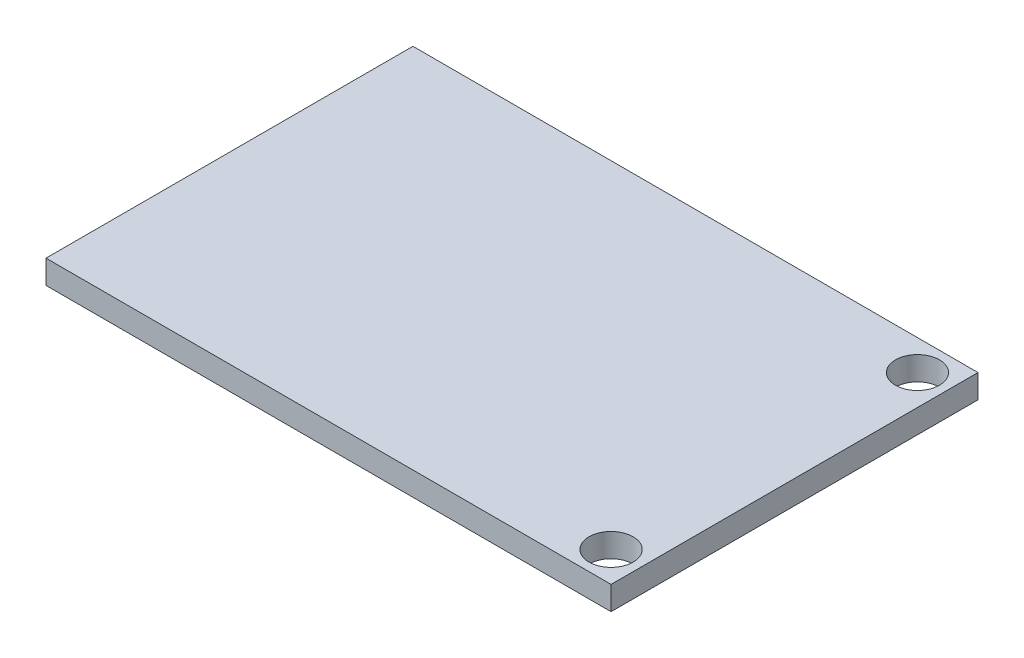
ISO-10303-21;
HEADER;
FILE_DESCRIPTION(('STEP AP214'),'2;1');
FILE_NAME('part.step','',(''),(''),'','','');
FILE_SCHEMA(('AUTOMOTIVE_DESIGN { 1 0 10303 214 1 1 1 1 }'));
ENDSEC;
DATA;
#1=APPLICATION_CONTEXT('core data for automotive mechanical design processes');
#2=APPLICATION_PROTOCOL_DEFINITION('international standard','automotive_design',2000,#1);
#3=PRODUCT_CONTEXT('',#1,'mechanical');
#4=PRODUCT('Part','Part','',(#3));
#5=PRODUCT_RELATED_PRODUCT_CATEGORY('part','',(#4));
#6=PRODUCT_DEFINITION_FORMATION('','',#4);
#7=PRODUCT_DEFINITION_CONTEXT('part definition',#1,'design');
#8=PRODUCT_DEFINITION('design','',#6,#7);
#9=PRODUCT_DEFINITION_SHAPE('','',#8);
#10=(LENGTH_UNIT() NAMED_UNIT(*) SI_UNIT(.MILLI.,.METRE.));
#11=(NAMED_UNIT(*) PLANE_ANGLE_UNIT() SI_UNIT($,.RADIAN.));
#12=(NAMED_UNIT(*) SI_UNIT($,.STERADIAN.) SOLID_ANGLE_UNIT());
#13=UNCERTAINTY_MEASURE_WITH_UNIT(LENGTH_MEASURE(1.E-05),#10,'distance_accuracy_value','');
#14=(GEOMETRIC_REPRESENTATION_CONTEXT(3) GLOBAL_UNCERTAINTY_ASSIGNED_CONTEXT((#13)) GLOBAL_UNIT_ASSIGNED_CONTEXT((#10,
#11,#12)) REPRESENTATION_CONTEXT('',''));
#15=CARTESIAN_POINT('',(0.,0.,0.));
#16=DIRECTION('',(0.,0.,1.));
#17=DIRECTION('',(1.,0.,0.));
#18=AXIS2_PLACEMENT_3D('',#15,#16,#17);
#19=CARTESIAN_POINT('',(19.558,1.6383,12.7));
#20=DIRECTION('',(-1.,0.,0.));
#21=DIRECTION('',(0.,0.,1.));
#22=AXIS2_PLACEMENT_3D('',#19,#20,#21);
#23=PLANE('',#22);
#24=DIRECTION('',(0.,0.,-1.));
#25=VECTOR('',#24,1.);
#26=CARTESIAN_POINT('',(19.558,0.,12.7));
#27=LINE('',#26,#25);
#28=CARTESIAN_POINT('',(19.558,0.,12.7));
#29=VERTEX_POINT('',#28);
#30=CARTESIAN_POINT('',(19.558,0.,-12.7));
#31=VERTEX_POINT('',#30);
#32=EDGE_CURVE('E109',#29,#31,#27,.T.);
#33=ORIENTED_EDGE('',*,*,#32,.T.);
#34=DIRECTION('',(0.,-1.,0.));
#35=VECTOR('',#34,1.);
#36=CARTESIAN_POINT('',(19.558,1.6383,-12.7));
#37=LINE('',#36,#35);
#38=CARTESIAN_POINT('',(19.558,1.6383,-12.7));
#39=VERTEX_POINT('',#38);
#40=EDGE_CURVE('E13',#39,#31,#37,.T.);
#41=ORIENTED_EDGE('',*,*,#40,.F.);
#42=DIRECTION('',(0.,0.,-1.));
#43=VECTOR('',#42,1.);
#44=CARTESIAN_POINT('',(19.558,1.6383,12.7));
#45=LINE('',#44,#43);
#46=CARTESIAN_POINT('',(19.558,1.6383,12.7));
#47=VERTEX_POINT('',#46);
#48=EDGE_CURVE('E97',#47,#39,#45,.T.);
#49=ORIENTED_EDGE('',*,*,#48,.F.);
#50=DIRECTION('',(0.,-1.,0.));
#51=VECTOR('',#50,1.);
#52=CARTESIAN_POINT('',(19.558,1.6383,12.7));
#53=LINE('',#52,#51);
#54=EDGE_CURVE('E105',#47,#29,#53,.T.);
#55=ORIENTED_EDGE('',*,*,#54,.T.);
#56=EDGE_LOOP('',(#33,#41,#49,#55));
#57=FACE_BOUND('',#56,.T.);
#58=ADVANCED_FACE('F46',(#57),#23,.F.);
#59=CARTESIAN_POINT('',(-19.558,1.6383,-12.7));
#60=DIRECTION('',(0.,0.,1.));
#61=DIRECTION('',(1.,0.,0.));
#62=AXIS2_PLACEMENT_3D('',#59,#60,#61);
#63=PLANE('',#62);
#64=DIRECTION('',(-1.,0.,0.));
#65=VECTOR('',#64,1.);
#66=CARTESIAN_POINT('',(-19.558,0.,-12.7));
#67=LINE('',#66,#65);
#68=CARTESIAN_POINT('',(-19.558,0.,-12.7));
#69=VERTEX_POINT('',#68);
#70=EDGE_CURVE('E101',#31,#69,#67,.T.);
#71=ORIENTED_EDGE('',*,*,#70,.T.);
#72=DIRECTION('',(0.,-1.,0.));
#73=VECTOR('',#72,1.);
#74=CARTESIAN_POINT('',(-19.558,1.6383,-12.7));
#75=LINE('',#74,#73);
#76=CARTESIAN_POINT('',(-19.558,1.6383,-12.7));
#77=VERTEX_POINT('',#76);
#78=EDGE_CURVE('E54',#77,#69,#75,.T.);
#79=ORIENTED_EDGE('',*,*,#78,.F.);
#80=DIRECTION('',(-1.,0.,0.));
#81=VECTOR('',#80,1.);
#82=CARTESIAN_POINT('',(-19.558,1.6383,-12.7));
#83=LINE('',#82,#81);
#84=EDGE_CURVE('E92',#39,#77,#83,.T.);
#85=ORIENTED_EDGE('',*,*,#84,.F.);
#86=ORIENTED_EDGE('',*,*,#40,.T.);
#87=EDGE_LOOP('',(#71,#79,#85,#86));
#88=FACE_BOUND('',#87,.T.);
#89=ADVANCED_FACE('F100',(#88),#63,.F.);
#90=CARTESIAN_POINT('',(-19.558,1.6383,12.7));
#91=DIRECTION('',(1.,0.,0.));
#92=DIRECTION('',(0.,0.,-1.));
#93=AXIS2_PLACEMENT_3D('',#90,#91,#92);
#94=PLANE('',#93);
#95=DIRECTION('',(0.,0.,1.));
#96=VECTOR('',#95,1.);
#97=CARTESIAN_POINT('',(-19.558,0.,12.7));
#98=LINE('',#97,#96);
#99=CARTESIAN_POINT('',(-19.558,0.,12.7));
#100=VERTEX_POINT('',#99);
#101=EDGE_CURVE('E79',#69,#100,#98,.T.);
#102=ORIENTED_EDGE('',*,*,#101,.T.);
#103=DIRECTION('',(0.,-1.,0.));
#104=VECTOR('',#103,1.);
#105=CARTESIAN_POINT('',(-19.558,1.6383,12.7));
#106=LINE('',#105,#104);
#107=CARTESIAN_POINT('',(-19.558,1.6383,12.7));
#108=VERTEX_POINT('',#107);
#109=EDGE_CURVE('E102',#108,#100,#106,.T.);
#110=ORIENTED_EDGE('',*,*,#109,.F.);
#111=DIRECTION('',(0.,0.,1.));
#112=VECTOR('',#111,1.);
#113=CARTESIAN_POINT('',(-19.558,1.6383,12.7));
#114=LINE('',#113,#112);
#115=EDGE_CURVE('E95',#77,#108,#114,.T.);
#116=ORIENTED_EDGE('',*,*,#115,.F.);
#117=ORIENTED_EDGE('',*,*,#78,.T.);
#118=EDGE_LOOP('',(#102,#110,#116,#117));
#119=FACE_BOUND('',#118,.T.);
#120=ADVANCED_FACE('F103',(#119),#94,.F.);
#121=CARTESIAN_POINT('',(-19.558,1.6383,12.7));
#122=DIRECTION('',(0.,0.,-1.));
#123=DIRECTION('',(-1.,0.,0.));
#124=AXIS2_PLACEMENT_3D('',#121,#122,#123);
#125=PLANE('',#124);
#126=DIRECTION('',(1.,0.,0.));
#127=VECTOR('',#126,1.);
#128=CARTESIAN_POINT('',(-19.558,0.,12.7));
#129=LINE('',#128,#127);
#130=EDGE_CURVE('E85',#100,#29,#129,.T.);
#131=ORIENTED_EDGE('',*,*,#130,.T.);
#132=ORIENTED_EDGE('',*,*,#54,.F.);
#133=DIRECTION('',(1.,0.,0.));
#134=VECTOR('',#133,1.);
#135=CARTESIAN_POINT('',(-19.558,1.6383,12.7));
#136=LINE('',#135,#134);
#137=EDGE_CURVE('E62',#108,#47,#136,.T.);
#138=ORIENTED_EDGE('',*,*,#137,.F.);
#139=ORIENTED_EDGE('',*,*,#109,.T.);
#140=EDGE_LOOP('',(#131,#132,#138,#139));
#141=FACE_BOUND('',#140,.T.);
#142=ADVANCED_FACE('F117',(#141),#125,.F.);
#143=CARTESIAN_POINT('',(0.,1.6383,0.));
#144=DIRECTION('',(0.,-1.,0.));
#145=DIRECTION('',(0.,0.,-1.));
#146=AXIS2_PLACEMENT_3D('',#143,#144,#145);
#147=PLANE('',#146);
#148=CARTESIAN_POINT('',(17.4625,1.6383,10.6045));
#149=DIRECTION('',(0.,1.,0.));
#150=DIRECTION('',(0.,0.,1.));
#151=AXIS2_PLACEMENT_3D('',#148,#149,#150);
#152=CIRCLE('',#151,1.524);
#153=CARTESIAN_POINT('',(17.4625,1.6383,12.1285));
#154=VERTEX_POINT('',#153);
#155=EDGE_CURVE('E129',#154,#154,#152,.T.);
#156=ORIENTED_EDGE('',*,*,#155,.F.);
#157=EDGE_LOOP('',(#156));
#158=FACE_BOUND('',#157,.T.);
#159=CARTESIAN_POINT('',(17.4625,1.6383,-10.6045));
#160=DIRECTION('',(0.,1.,0.));
#161=DIRECTION('',(0.,0.,-1.));
#162=AXIS2_PLACEMENT_3D('',#159,#160,#161);
#163=CIRCLE('',#162,1.524);
#164=CARTESIAN_POINT('',(17.4625,1.6383,-9.0805));
#165=VERTEX_POINT('',#164);
#166=EDGE_CURVE('E123',#165,#165,#163,.T.);
#167=ORIENTED_EDGE('',*,*,#166,.F.);
#168=EDGE_LOOP('',(#167));
#169=FACE_BOUND('',#168,.T.);
#170=ORIENTED_EDGE('',*,*,#48,.T.);
#171=ORIENTED_EDGE('',*,*,#84,.T.);
#172=ORIENTED_EDGE('',*,*,#115,.T.);
#173=ORIENTED_EDGE('',*,*,#137,.T.);
#174=EDGE_LOOP('',(#170,#171,#172,#173));
#175=FACE_BOUND('',#174,.T.);
#176=ADVANCED_FACE('F93',(#158,#169,#175),#147,.F.);
#177=CARTESIAN_POINT('',(0.,0.,0.));
#178=DIRECTION('',(0.,-1.,0.));
#179=DIRECTION('',(0.,0.,-1.));
#180=AXIS2_PLACEMENT_3D('',#177,#178,#179);
#181=PLANE('',#180);
#182=CARTESIAN_POINT('',(17.4625,0.,10.6045));
#183=DIRECTION('',(0.,1.,0.));
#184=DIRECTION('',(0.,0.,1.));
#185=AXIS2_PLACEMENT_3D('',#182,#183,#184);
#186=CIRCLE('',#185,1.524);
#187=CARTESIAN_POINT('',(17.4625,0.,12.1285));
#188=VERTEX_POINT('',#187);
#189=EDGE_CURVE('E112',#188,#188,#186,.T.);
#190=ORIENTED_EDGE('',*,*,#189,.T.);
#191=EDGE_LOOP('',(#190));
#192=FACE_BOUND('',#191,.T.);
#193=CARTESIAN_POINT('',(17.4625,0.,-10.6045));
#194=DIRECTION('',(0.,1.,0.));
#195=DIRECTION('',(0.,0.,-1.));
#196=AXIS2_PLACEMENT_3D('',#193,#194,#195);
#197=CIRCLE('',#196,1.524);
#198=CARTESIAN_POINT('',(17.4625,0.,-9.0805));
#199=VERTEX_POINT('',#198);
#200=EDGE_CURVE('E126',#199,#199,#197,.T.);
#201=ORIENTED_EDGE('',*,*,#200,.T.);
#202=EDGE_LOOP('',(#201));
#203=FACE_BOUND('',#202,.T.);
#204=ORIENTED_EDGE('',*,*,#32,.F.);
#205=ORIENTED_EDGE('',*,*,#130,.F.);
#206=ORIENTED_EDGE('',*,*,#101,.F.);
#207=ORIENTED_EDGE('',*,*,#70,.F.);
#208=EDGE_LOOP('',(#204,#205,#206,#207));
#209=FACE_BOUND('',#208,.T.);
#210=ADVANCED_FACE('F120',(#192,#203,#209),#181,.T.);
#211=CARTESIAN_POINT('',(17.4625,0.,-10.6045));
#212=DIRECTION('',(0.,1.,0.));
#213=DIRECTION('',(0.,0.,1.));
#214=AXIS2_PLACEMENT_3D('',#211,#212,#213);
#215=CYLINDRICAL_SURFACE('',#214,1.524);
#216=CARTESIAN_POINT('',(17.4625,0.,-9.0805));
#217=CARTESIAN_POINT('',(17.4625,0.017065625,-9.0805));
#218=CARTESIAN_POINT('',(17.4625,0.03413125,-9.0805));
#219=CARTESIAN_POINT('',(17.4625,0.0682625,-9.0805));
#220=CARTESIAN_POINT('',(17.4625,0.085328125,-9.0805));
#221=CARTESIAN_POINT('',(17.4625,0.119459375,-9.0805));
#222=CARTESIAN_POINT('',(17.4625,0.136525,-9.0805));
#223=CARTESIAN_POINT('',(17.4625,0.17065625,-9.0805));
#224=CARTESIAN_POINT('',(17.4625,0.187721875,-9.0805));
#225=CARTESIAN_POINT('',(17.4625,0.221853125,-9.0805));
#226=CARTESIAN_POINT('',(17.4625,0.23891875,-9.0805));
#227=CARTESIAN_POINT('',(17.4625,0.27305,-9.0805));
#228=CARTESIAN_POINT('',(17.4625,0.290115625,-9.0805));
#229=CARTESIAN_POINT('',(17.4625,0.324246875,-9.0805));
#230=CARTESIAN_POINT('',(17.4625,0.3413125,-9.0805));
#231=CARTESIAN_POINT('',(17.4625,0.37544375,-9.0805));
#232=CARTESIAN_POINT('',(17.4625,0.392509375,-9.0805));
#233=CARTESIAN_POINT('',(17.4625,0.426640625,-9.0805));
#234=CARTESIAN_POINT('',(17.4625,0.44370625,-9.0805));
#235=CARTESIAN_POINT('',(17.4625,0.4778375,-9.0805));
#236=CARTESIAN_POINT('',(17.4625,0.494903125,-9.0805));
#237=CARTESIAN_POINT('',(17.4625,0.529034375,-9.0805));
#238=CARTESIAN_POINT('',(17.4625,0.5461,-9.0805));
#239=CARTESIAN_POINT('',(17.4625,0.58023125,-9.0805));
#240=CARTESIAN_POINT('',(17.4625,0.597296875,-9.0805));
#241=CARTESIAN_POINT('',(17.4625,0.631428125,-9.0805));
#242=CARTESIAN_POINT('',(17.4625,0.64849375,-9.0805));
#243=CARTESIAN_POINT('',(17.4625,0.682625,-9.0805));
#244=CARTESIAN_POINT('',(17.4625,0.699690625,-9.0805));
#245=CARTESIAN_POINT('',(17.4625,0.733821875,-9.0805));
#246=CARTESIAN_POINT('',(17.4625,0.7508875,-9.0805));
#247=CARTESIAN_POINT('',(17.4625,0.78501875,-9.0805));
#248=CARTESIAN_POINT('',(17.4625,0.802084375,-9.0805));
#249=CARTESIAN_POINT('',(17.4625,0.836215625,-9.0805));
#250=CARTESIAN_POINT('',(17.4625,0.85328125,-9.0805));
#251=CARTESIAN_POINT('',(17.4625,0.8874125,-9.0805));
#252=CARTESIAN_POINT('',(17.4625,0.904478125,-9.0805));
#253=CARTESIAN_POINT('',(17.4625,0.938609375,-9.0805));
#254=CARTESIAN_POINT('',(17.4625,0.955675,-9.0805));
#255=CARTESIAN_POINT('',(17.4625,0.98980625,-9.0805));
#256=CARTESIAN_POINT('',(17.4625,1.006871875,-9.0805));
#257=CARTESIAN_POINT('',(17.4625,1.041003125,-9.0805));
#258=CARTESIAN_POINT('',(17.4625,1.05806875,-9.0805));
#259=CARTESIAN_POINT('',(17.4625,1.0922,-9.0805));
#260=CARTESIAN_POINT('',(17.4625,1.109265625,-9.0805));
#261=CARTESIAN_POINT('',(17.4625,1.143396875,-9.0805));
#262=CARTESIAN_POINT('',(17.4625,1.1604625,-9.0805));
#263=CARTESIAN_POINT('',(17.4625,1.19459375,-9.0805));
#264=CARTESIAN_POINT('',(17.4625,1.211659375,-9.0805));
#265=CARTESIAN_POINT('',(17.4625,1.245790625,-9.0805));
#266=CARTESIAN_POINT('',(17.4625,1.26285625,-9.0805));
#267=CARTESIAN_POINT('',(17.4625,1.2969875,-9.0805));
#268=CARTESIAN_POINT('',(17.4625,1.314053125,-9.0805));
#269=CARTESIAN_POINT('',(17.4625,1.348184375,-9.0805));
#270=CARTESIAN_POINT('',(17.4625,1.36525,-9.0805));
#271=CARTESIAN_POINT('',(17.4625,1.39938125,-9.0805));
#272=CARTESIAN_POINT('',(17.4625,1.416446875,-9.0805));
#273=CARTESIAN_POINT('',(17.4625,1.450578125,-9.0805));
#274=CARTESIAN_POINT('',(17.4625,1.46764375,-9.0805));
#275=CARTESIAN_POINT('',(17.4625,1.501775,-9.0805));
#276=CARTESIAN_POINT('',(17.4625,1.518840625,-9.0805));
#277=CARTESIAN_POINT('',(17.4625,1.552971875,-9.0805));
#278=CARTESIAN_POINT('',(17.4625,1.5700375,-9.0805));
#279=CARTESIAN_POINT('',(17.4625,1.60416875,-9.0805));
#280=CARTESIAN_POINT('',(17.4625,1.621234375,-9.0805));
#281=CARTESIAN_POINT('',(17.4625,1.6383,-9.0805));
#282=B_SPLINE_CURVE_WITH_KNOTS('',3,(#216,#217,#218,#219,#220,#221,#222,#223,#224,#225,#226,
#227,#228,#229,#230,#231,#232,#233,#234,#235,#236,#237,#238,#239,#240,#241,#242,#243,#244,#245,
#246,#247,#248,#249,#250,#251,#252,#253,#254,#255,#256,#257,#258,#259,#260,#261,#262,#263,#264,
#265,#266,#267,#268,#269,#270,#271,#272,#273,#274,#275,#276,#277,#278,#279,#280,#281),
.UNSPECIFIED.,.F.,.F.,(4,2,2,2,2,2,2,2,2,2,2,2,2,2,2,2,2,2,2,2,2,2,2,2,2,2,2,2,2,2,2,2,4),(0.,
0.051196875,0.10239375,0.153590625,0.2047875,0.255984375,0.30718125,0.358378125,0.409575,
0.460771875,0.51196875,0.563165625,0.6143625,0.665559375,0.71675625,0.767953125,0.81915,
0.870346875,0.92154375,0.972740625,1.0239375,1.075134375,1.12633125,1.177528125,1.228725,
1.279921875,1.33111875,1.382315625,1.4335125,1.484709375,1.53590625,1.587103125,1.6383),.UNSPECIFIED.);
#283=EDGE_CURVE('BSEAM140',#199,#165,#282,.T.);
#284=ORIENTED_EDGE('',*,*,#200,.F.);
#285=ORIENTED_EDGE('',*,*,#166,.T.);
#286=ORIENTED_EDGE('',*,*,#283,.T.);
#287=ORIENTED_EDGE('',*,*,#283,.F.);
#288=EDGE_LOOP('',(#284,#286,#285,#287));
#289=FACE_BOUND('',#288,.T.);
#290=ADVANCED_FACE('F140',(#289),#215,.F.);
#291=CARTESIAN_POINT('',(17.4625,0.,10.6045));
#292=DIRECTION('',(0.,1.,0.));
#293=DIRECTION('',(0.,0.,1.));
#294=AXIS2_PLACEMENT_3D('',#291,#292,#293);
#295=CYLINDRICAL_SURFACE('',#294,1.524);
#296=CARTESIAN_POINT('',(17.4625,0.,12.1285));
#297=CARTESIAN_POINT('',(17.4625,0.017065625,12.1285));
#298=CARTESIAN_POINT('',(17.4625,0.03413125,12.1285));
#299=CARTESIAN_POINT('',(17.4625,0.0682625,12.1285));
#300=CARTESIAN_POINT('',(17.4625,0.085328125,12.1285));
#301=CARTESIAN_POINT('',(17.4625,0.119459375,12.1285));
#302=CARTESIAN_POINT('',(17.4625,0.136525,12.1285));
#303=CARTESIAN_POINT('',(17.4625,0.17065625,12.1285));
#304=CARTESIAN_POINT('',(17.4625,0.187721875,12.1285));
#305=CARTESIAN_POINT('',(17.4625,0.221853125,12.1285));
#306=CARTESIAN_POINT('',(17.4625,0.23891875,12.1285));
#307=CARTESIAN_POINT('',(17.4625,0.27305,12.1285));
#308=CARTESIAN_POINT('',(17.4625,0.290115625,12.1285));
#309=CARTESIAN_POINT('',(17.4625,0.324246875,12.1285));
#310=CARTESIAN_POINT('',(17.4625,0.3413125,12.1285));
#311=CARTESIAN_POINT('',(17.4625,0.37544375,12.1285));
#312=CARTESIAN_POINT('',(17.4625,0.392509375,12.1285));
#313=CARTESIAN_POINT('',(17.4625,0.426640625,12.1285));
#314=CARTESIAN_POINT('',(17.4625,0.44370625,12.1285));
#315=CARTESIAN_POINT('',(17.4625,0.4778375,12.1285));
#316=CARTESIAN_POINT('',(17.4625,0.494903125,12.1285));
#317=CARTESIAN_POINT('',(17.4625,0.529034375,12.1285));
#318=CARTESIAN_POINT('',(17.4625,0.5461,12.1285));
#319=CARTESIAN_POINT('',(17.4625,0.58023125,12.1285));
#320=CARTESIAN_POINT('',(17.4625,0.597296875,12.1285));
#321=CARTESIAN_POINT('',(17.4625,0.631428125,12.1285));
#322=CARTESIAN_POINT('',(17.4625,0.64849375,12.1285));
#323=CARTESIAN_POINT('',(17.4625,0.682625,12.1285));
#324=CARTESIAN_POINT('',(17.4625,0.699690625,12.1285));
#325=CARTESIAN_POINT('',(17.4625,0.733821875,12.1285));
#326=CARTESIAN_POINT('',(17.4625,0.7508875,12.1285));
#327=CARTESIAN_POINT('',(17.4625,0.78501875,12.1285));
#328=CARTESIAN_POINT('',(17.4625,0.802084375,12.1285));
#329=CARTESIAN_POINT('',(17.4625,0.836215625,12.1285));
#330=CARTESIAN_POINT('',(17.4625,0.85328125,12.1285));
#331=CARTESIAN_POINT('',(17.4625,0.8874125,12.1285));
#332=CARTESIAN_POINT('',(17.4625,0.904478125,12.1285));
#333=CARTESIAN_POINT('',(17.4625,0.938609375,12.1285));
#334=CARTESIAN_POINT('',(17.4625,0.955675,12.1285));
#335=CARTESIAN_POINT('',(17.4625,0.98980625,12.1285));
#336=CARTESIAN_POINT('',(17.4625,1.006871875,12.1285));
#337=CARTESIAN_POINT('',(17.4625,1.041003125,12.1285));
#338=CARTESIAN_POINT('',(17.4625,1.05806875,12.1285));
#339=CARTESIAN_POINT('',(17.4625,1.0922,12.1285));
#340=CARTESIAN_POINT('',(17.4625,1.109265625,12.1285));
#341=CARTESIAN_POINT('',(17.4625,1.143396875,12.1285));
#342=CARTESIAN_POINT('',(17.4625,1.1604625,12.1285));
#343=CARTESIAN_POINT('',(17.4625,1.19459375,12.1285));
#344=CARTESIAN_POINT('',(17.4625,1.211659375,12.1285));
#345=CARTESIAN_POINT('',(17.4625,1.245790625,12.1285));
#346=CARTESIAN_POINT('',(17.4625,1.26285625,12.1285));
#347=CARTESIAN_POINT('',(17.4625,1.2969875,12.1285));
#348=CARTESIAN_POINT('',(17.4625,1.314053125,12.1285));
#349=CARTESIAN_POINT('',(17.4625,1.348184375,12.1285));
#350=CARTESIAN_POINT('',(17.4625,1.36525,12.1285));
#351=CARTESIAN_POINT('',(17.4625,1.39938125,12.1285));
#352=CARTESIAN_POINT('',(17.4625,1.416446875,12.1285));
#353=CARTESIAN_POINT('',(17.4625,1.450578125,12.1285));
#354=CARTESIAN_POINT('',(17.4625,1.46764375,12.1285));
#355=CARTESIAN_POINT('',(17.4625,1.501775,12.1285));
#356=CARTESIAN_POINT('',(17.4625,1.518840625,12.1285));
#357=CARTESIAN_POINT('',(17.4625,1.552971875,12.1285));
#358=CARTESIAN_POINT('',(17.4625,1.5700375,12.1285));
#359=CARTESIAN_POINT('',(17.4625,1.60416875,12.1285));
#360=CARTESIAN_POINT('',(17.4625,1.621234375,12.1285));
#361=CARTESIAN_POINT('',(17.4625,1.6383,12.1285));
#362=B_SPLINE_CURVE_WITH_KNOTS('',3,(#296,#297,#298,#299,#300,#301,#302,#303,#304,#305,#306,
#307,#308,#309,#310,#311,#312,#313,#314,#315,#316,#317,#318,#319,#320,#321,#322,#323,#324,#325,
#326,#327,#328,#329,#330,#331,#332,#333,#334,#335,#336,#337,#338,#339,#340,#341,#342,#343,#344,
#345,#346,#347,#348,#349,#350,#351,#352,#353,#354,#355,#356,#357,#358,#359,#360,#361),
.UNSPECIFIED.,.F.,.F.,(4,2,2,2,2,2,2,2,2,2,2,2,2,2,2,2,2,2,2,2,2,2,2,2,2,2,2,2,2,2,2,2,4),(0.,
0.051196875,0.10239375,0.153590625,0.2047875,0.255984375,0.30718125,0.358378125,0.409575,
0.460771875,0.51196875,0.563165625,0.6143625,0.665559375,0.71675625,0.767953125,0.81915,
0.870346875,0.92154375,0.972740625,1.0239375,1.075134375,1.12633125,1.177528125,1.228725,
1.279921875,1.33111875,1.382315625,1.4335125,1.484709375,1.53590625,1.587103125,1.6383),.UNSPECIFIED.);
#363=EDGE_CURVE('BSEAM137',#188,#154,#362,.T.);
#364=ORIENTED_EDGE('',*,*,#189,.F.);
#365=ORIENTED_EDGE('',*,*,#155,.T.);
#366=ORIENTED_EDGE('',*,*,#363,.T.);
#367=ORIENTED_EDGE('',*,*,#363,.F.);
#368=EDGE_LOOP('',(#364,#366,#365,#367));
#369=FACE_BOUND('',#368,.T.);
#370=ADVANCED_FACE('F137',(#369),#295,.F.);
#371=CLOSED_SHELL('',(#58,#89,#120,#142,#176,#210,#290,#370));
#372=MANIFOLD_SOLID_BREP('B2',#371);
#373=ADVANCED_BREP_SHAPE_REPRESENTATION('',(#18,#372),#14);
#374=SHAPE_DEFINITION_REPRESENTATION(#9,#373);
ENDSEC;
END-ISO-10303-21;
